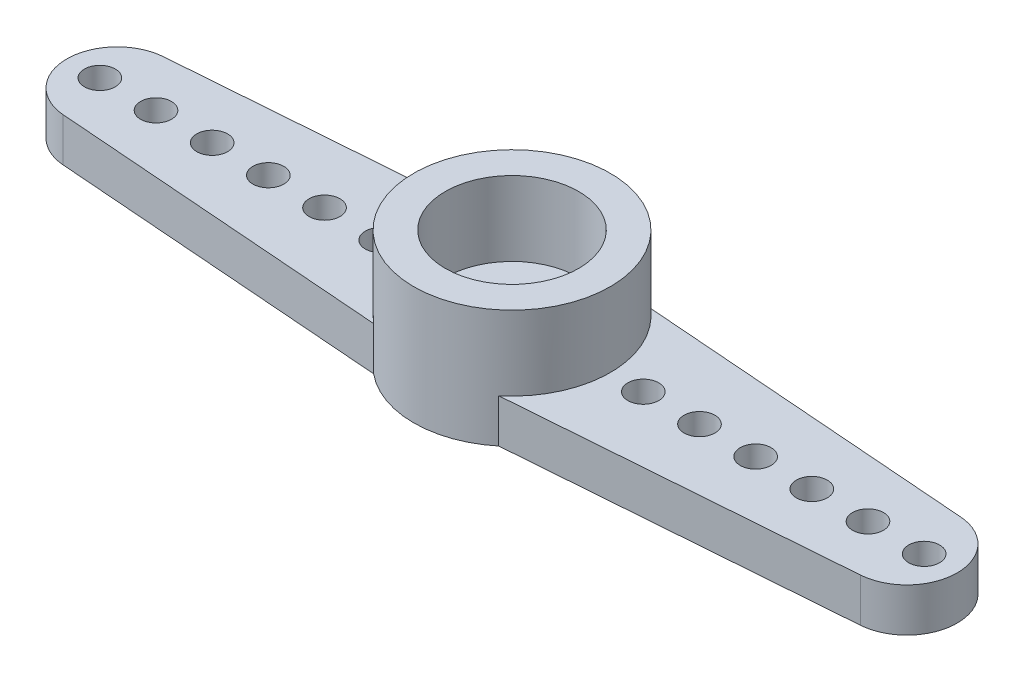
ISO-10303-21;
HEADER;
FILE_DESCRIPTION(('STEP AP214'),'2;1');
FILE_NAME('part.step','',(''),(''),'','','');
FILE_SCHEMA(('AUTOMOTIVE_DESIGN { 1 0 10303 214 1 1 1 1 }'));
ENDSEC;
DATA;
#1=APPLICATION_CONTEXT('core data for automotive mechanical design processes');
#2=APPLICATION_PROTOCOL_DEFINITION('international standard','automotive_design',2000,#1);
#3=PRODUCT_CONTEXT('',#1,'mechanical');
#4=PRODUCT('Part','Part','',(#3));
#5=PRODUCT_RELATED_PRODUCT_CATEGORY('part','',(#4));
#6=PRODUCT_DEFINITION_FORMATION('','',#4);
#7=PRODUCT_DEFINITION_CONTEXT('part definition',#1,'design');
#8=PRODUCT_DEFINITION('design','',#6,#7);
#9=PRODUCT_DEFINITION_SHAPE('','',#8);
#10=(LENGTH_UNIT() NAMED_UNIT(*) SI_UNIT(.MILLI.,.METRE.));
#11=(NAMED_UNIT(*) PLANE_ANGLE_UNIT() SI_UNIT($,.RADIAN.));
#12=(NAMED_UNIT(*) SI_UNIT($,.STERADIAN.) SOLID_ANGLE_UNIT());
#13=UNCERTAINTY_MEASURE_WITH_UNIT(LENGTH_MEASURE(1.E-05),#10,'distance_accuracy_value','');
#14=(GEOMETRIC_REPRESENTATION_CONTEXT(3) GLOBAL_UNCERTAINTY_ASSIGNED_CONTEXT((#13)) GLOBAL_UNIT_ASSIGNED_CONTEXT((#10,
#11,#12)) REPRESENTATION_CONTEXT('',''));
#15=CARTESIAN_POINT('',(0.,0.,0.));
#16=DIRECTION('',(0.,0.,1.));
#17=DIRECTION('',(1.,0.,0.));
#18=AXIS2_PLACEMENT_3D('',#15,#16,#17);
#19=CARTESIAN_POINT('',(14.1944880307206,1.705,-1.78667177447598));
#20=CARTESIAN_POINT('',(14.1944880307207,1.65333333333337,-1.78667177447597));
#21=CARTESIAN_POINT('',(14.1944880307206,1.60166666666662,-1.78667177447598));
#22=CARTESIAN_POINT('',(14.1944880307206,1.03333333333377,-1.78667177447598));
#23=CARTESIAN_POINT('',(14.1944880307211,0.516666666666661,-1.78667177447595));
#24=CARTESIAN_POINT('',(14.1944880307206,-0.0516666666666656,-1.78667177447599));
#25=CARTESIAN_POINT('',(14.1944880307206,-0.103333333333332,-1.78667177447598));
#26=CARTESIAN_POINT('',(14.1944880307206,-0.154999999999999,-1.78667177447598));
#27=CARTESIAN_POINT('',(17.2868347958286,1.705,-1.55066965502484));
#28=CARTESIAN_POINT('',(17.2868347958281,1.65333333333317,-1.55066965502464));
#29=CARTESIAN_POINT('',(17.2868347958288,1.60166666666689,-1.55066965502491));
#30=CARTESIAN_POINT('',(17.2868347958268,1.03333333333114,-1.55066965502417));
#31=CARTESIAN_POINT('',(17.2868347958268,0.516666666666661,-1.55066965502417));
#32=CARTESIAN_POINT('',(17.2868347958288,-0.0516666666666656,-1.55066965502491));
#33=CARTESIAN_POINT('',(17.2868347958286,-0.103333333333332,-1.55066965502484));
#34=CARTESIAN_POINT('',(17.2868347958286,-0.154999999999999,-1.55066965502484));
#35=CARTESIAN_POINT('',(17.2868347958286,1.705,1.55066965502484));
#36=CARTESIAN_POINT('',(17.2868347958281,1.65333333333319,1.55066965502454));
#37=CARTESIAN_POINT('',(17.2868347958288,1.60166666666686,1.55066965502494));
#38=CARTESIAN_POINT('',(17.2868347958268,1.03333333333142,1.55066965502383));
#39=CARTESIAN_POINT('',(17.2868347958268,0.516666666666661,1.55066965502383));
#40=CARTESIAN_POINT('',(17.2868347958288,-0.0516666666666656,1.55066965502494));
#41=CARTESIAN_POINT('',(17.2868347958286,-0.103333333333332,1.55066965502484));
#42=CARTESIAN_POINT('',(17.2868347958286,-0.154999999999999,1.55066965502484));
#43=CARTESIAN_POINT('',(14.1944880307206,1.705,1.78667177447598));
#44=CARTESIAN_POINT('',(14.1944880307207,1.6533333333334,1.78667177447597));
#45=CARTESIAN_POINT('',(14.1944880307206,1.60166666666658,1.78667177447598));
#46=CARTESIAN_POINT('',(14.1944880307206,1.03333333333416,1.78667177447598));
#47=CARTESIAN_POINT('',(14.1944880307211,0.516666666666661,1.78667177447595));
#48=CARTESIAN_POINT('',(14.1944880307206,-0.0516666666666656,1.78667177447599));
#49=CARTESIAN_POINT('',(14.1944880307206,-0.103333333333332,1.78667177447598));
#50=CARTESIAN_POINT('',(14.1944880307206,-0.154999999999999,1.78667177447598));
#51=(BOUNDED_SURFACE() B_SPLINE_SURFACE(3,3,((#19,#20,#21,#22,#23,#24,#25,#26),(#27,#28,#29,#30,
#31,#32,#33,#34),(#35,#36,#37,#38,#39,#40,#41,#42),(#43,#44,#45,#46,#47,#48,#49,#50)),
.UNSPECIFIED.,.F.,.F.,.F.) B_SPLINE_SURFACE_WITH_KNOTS((4,4),(4,2,2,4),(0.,1.),(-0.1,0.,1.,1.1),
.UNSPECIFIED.) GEOMETRIC_REPRESENTATION_ITEM() RATIONAL_B_SPLINE_SURFACE(((1.,1.,1.,1.,1.,1.,1.,
1.),(0.384064559610617,0.384064559610617,0.384064559610617,0.384064559610617,0.384064559610617,
0.384064559610617,0.384064559610617,0.384064559610617),(0.384064559610617,0.384064559610617,
0.384064559610617,0.384064559610617,0.384064559610617,0.384064559610617,0.384064559610617,
0.384064559610617),(1.,1.,1.,1.,1.,1.,1.,1.))) REPRESENTATION_ITEM('') SURFACE());
#52=CARTESIAN_POINT('',(14.1944880307206,-0.154999999999999,-1.78667177447598));
#53=CARTESIAN_POINT('',(14.1944880307206,-0.103333333333332,-1.78667177447598));
#54=CARTESIAN_POINT('',(14.1944880307206,-0.0516666666666656,-1.78667177447599));
#55=CARTESIAN_POINT('',(14.1944880307211,0.516666666666661,-1.78667177447595));
#56=CARTESIAN_POINT('',(14.1944880307206,1.03333333333377,-1.78667177447598));
#57=CARTESIAN_POINT('',(14.1944880307206,1.60166666666662,-1.78667177447598));
#58=CARTESIAN_POINT('',(14.1944880307207,1.65333333333337,-1.78667177447597));
#59=CARTESIAN_POINT('',(14.1944880307206,1.705,-1.78667177447598));
#60=(BOUNDED_CURVE() B_SPLINE_CURVE(3,(#52,#53,#54,#55,#56,#57,#58,#59),.UNSPECIFIED.,.F.,
.F.) B_SPLINE_CURVE_WITH_KNOTS((4,2,2,4),(-0.1,0.,1.,1.1),
.UNSPECIFIED.) CURVE() GEOMETRIC_REPRESENTATION_ITEM() RATIONAL_B_SPLINE_CURVE((1.,1.,1.,1.,1.,
1.,1.,1.)) REPRESENTATION_ITEM(''));
#61=CARTESIAN_POINT('',(14.1944880307206,1.55,-1.78667177447598));
#62=VERTEX_POINT('',#61);
#63=CARTESIAN_POINT('',(14.1944880307206,0.,-1.78667177447598));
#64=VERTEX_POINT('',#63);
#65=EDGE_CURVE('E274',#62,#64,#60,.F.);
#66=CARTESIAN_POINT('',(14.1944880307206,1.55,-1.78667177447598));
#67=CARTESIAN_POINT('',(17.2868347958286,1.55,-1.55066965502484));
#68=CARTESIAN_POINT('',(17.2868347958286,1.55,1.55066965502484));
#69=CARTESIAN_POINT('',(14.1944880307206,1.55,1.78667177447598));
#70=(BOUNDED_CURVE() B_SPLINE_CURVE(3,(#66,#67,#68,#69),.UNSPECIFIED.,.F.,
.F.) B_SPLINE_CURVE_WITH_KNOTS((4,4),(0.,1.),
.UNSPECIFIED.) CURVE() GEOMETRIC_REPRESENTATION_ITEM() RATIONAL_B_SPLINE_CURVE((1.,
0.384064559610617,0.384064559610617,1.)) REPRESENTATION_ITEM(''));
#71=CARTESIAN_POINT('',(14.1944880307206,1.55,1.78667177447598));
#72=VERTEX_POINT('',#71);
#73=EDGE_CURVE('E45',#72,#62,#70,.F.);
#74=CARTESIAN_POINT('',(14.1944880307206,1.705,1.78667177447598));
#75=CARTESIAN_POINT('',(14.1944880307207,1.6533333333334,1.78667177447597));
#76=CARTESIAN_POINT('',(14.1944880307206,1.60166666666658,1.78667177447598));
#77=CARTESIAN_POINT('',(14.1944880307206,1.03333333333416,1.78667177447598));
#78=CARTESIAN_POINT('',(14.1944880307211,0.516666666666661,1.78667177447595));
#79=CARTESIAN_POINT('',(14.1944880307206,-0.0516666666666656,1.78667177447599));
#80=CARTESIAN_POINT('',(14.1944880307206,-0.103333333333332,1.78667177447598));
#81=CARTESIAN_POINT('',(14.1944880307206,-0.154999999999999,1.78667177447598));
#82=(BOUNDED_CURVE() B_SPLINE_CURVE(3,(#74,#75,#76,#77,#78,#79,#80,#81),.UNSPECIFIED.,.F.,
.F.) B_SPLINE_CURVE_WITH_KNOTS((4,2,2,4),(-0.1,0.,1.,1.1),
.UNSPECIFIED.) CURVE() GEOMETRIC_REPRESENTATION_ITEM() RATIONAL_B_SPLINE_CURVE((1.,1.,1.,1.,1.,
1.,1.,1.)) REPRESENTATION_ITEM(''));
#83=CARTESIAN_POINT('',(14.1944880307206,0.,1.78667177447598));
#84=VERTEX_POINT('',#83);
#85=EDGE_CURVE('E107',#84,#72,#82,.F.);
#86=CARTESIAN_POINT('',(14.1944880307206,0.,1.78667177447598));
#87=CARTESIAN_POINT('',(17.2868347958286,0.,1.55066965502484));
#88=CARTESIAN_POINT('',(17.2868347958286,0.,-1.55066965502484));
#89=CARTESIAN_POINT('',(14.1944880307206,0.,-1.78667177447598));
#90=(BOUNDED_CURVE() B_SPLINE_CURVE(3,(#86,#87,#88,#89),.UNSPECIFIED.,.F.,
.F.) B_SPLINE_CURVE_WITH_KNOTS((4,4),(0.,1.),
.UNSPECIFIED.) CURVE() GEOMETRIC_REPRESENTATION_ITEM() RATIONAL_B_SPLINE_CURVE((1.,
0.384064559610617,0.384064559610617,1.)) REPRESENTATION_ITEM(''));
#91=EDGE_CURVE('E11',#64,#84,#90,.F.);
#92=ORIENTED_EDGE('',*,*,#65,.F.);
#93=ORIENTED_EDGE('',*,*,#73,.F.);
#94=ORIENTED_EDGE('',*,*,#85,.F.);
#95=ORIENTED_EDGE('',*,*,#91,.F.);
#96=EDGE_LOOP('',(#92,#93,#94,#95));
#97=FACE_BOUND('',#96,.T.);
#98=ADVANCED_FACE('F33',(#97),#51,.T.);
#99=CARTESIAN_POINT('',(-14.1944880307206,1.705,1.78667177447598));
#100=CARTESIAN_POINT('',(-14.1944880307206,1.6533333333334,1.78667177447598));
#101=CARTESIAN_POINT('',(-14.1944880307206,1.60166666666658,1.78667177447598));
#102=CARTESIAN_POINT('',(-14.1944880307206,1.03333333333416,1.78667177447598));
#103=CARTESIAN_POINT('',(-14.1944880307206,0.516666666666661,1.78667177447598));
#104=CARTESIAN_POINT('',(-14.1944880307206,-0.0516666666666656,1.78667177447598));
#105=CARTESIAN_POINT('',(-14.1944880307206,-0.103333333333332,1.78667177447598));
#106=CARTESIAN_POINT('',(-14.1944880307206,-0.154999999999999,1.78667177447598));
#107=CARTESIAN_POINT('',(-17.2868347958286,1.705,1.55066965502484));
#108=CARTESIAN_POINT('',(-17.2868347958286,1.65333333333319,1.55066965502484));
#109=CARTESIAN_POINT('',(-17.2868347958287,1.60166666666686,1.55066965502491));
#110=CARTESIAN_POINT('',(-17.2868347958277,1.03333333333142,1.55066965502417));
#111=CARTESIAN_POINT('',(-17.2868347958286,0.516666666666661,1.55066965502484));
#112=CARTESIAN_POINT('',(-17.2868347958286,-0.0516666666666656,1.55066965502484));
#113=CARTESIAN_POINT('',(-17.2868347958286,-0.103333333333332,1.55066965502484));
#114=CARTESIAN_POINT('',(-17.2868347958286,-0.154999999999999,1.55066965502484));
#115=CARTESIAN_POINT('',(-17.2868347958286,1.705,-1.55066965502484));
#116=CARTESIAN_POINT('',(-17.2868347958286,1.65333333333317,-1.55066965502484));
#117=CARTESIAN_POINT('',(-17.2868347958287,1.60166666666689,-1.55066965502494));
#118=CARTESIAN_POINT('',(-17.2868347958277,1.03333333333114,-1.55066965502389));
#119=CARTESIAN_POINT('',(-17.2868347958286,0.516666666666661,-1.55066965502484));
#120=CARTESIAN_POINT('',(-17.2868347958286,-0.0516666666666656,-1.55066965502484));
#121=CARTESIAN_POINT('',(-17.2868347958286,-0.103333333333332,-1.55066965502484));
#122=CARTESIAN_POINT('',(-17.2868347958286,-0.154999999999999,-1.55066965502484));
#123=CARTESIAN_POINT('',(-14.1944880307206,1.705,-1.78667177447598));
#124=CARTESIAN_POINT('',(-14.1944880307206,1.65333333333337,-1.78667177447598));
#125=CARTESIAN_POINT('',(-14.1944880307206,1.60166666666662,-1.78667177447598));
#126=CARTESIAN_POINT('',(-14.1944880307206,1.03333333333377,-1.78667177447598));
#127=CARTESIAN_POINT('',(-14.1944880307206,0.516666666666661,-1.78667177447598));
#128=CARTESIAN_POINT('',(-14.1944880307206,-0.0516666666666656,-1.78667177447598));
#129=CARTESIAN_POINT('',(-14.1944880307206,-0.103333333333332,-1.78667177447598));
#130=CARTESIAN_POINT('',(-14.1944880307206,-0.154999999999999,-1.78667177447598));
#131=(BOUNDED_SURFACE() B_SPLINE_SURFACE(3,3,((#99,#100,#101,#102,#103,#104,#105,#106),(#107,
#108,#109,#110,#111,#112,#113,#114),(#115,#116,#117,#118,#119,#120,#121,#122),(#123,#124,#125,
#126,#127,#128,#129,#130)),.UNSPECIFIED.,.F.,.F.,.F.) B_SPLINE_SURFACE_WITH_KNOTS((4,4),(4,2,2,
4),(0.,1.),(-0.1,0.,1.,1.1),
.UNSPECIFIED.) GEOMETRIC_REPRESENTATION_ITEM() RATIONAL_B_SPLINE_SURFACE(((1.,1.,1.,1.,1.,1.,1.,
1.),(0.384064559610617,0.384064559610617,0.384064559610616,0.384064559610616,0.384064559610616,
0.384064559610616,0.384064559610617,0.384064559610617),(0.384064559610617,0.384064559610617,
0.384064559610616,0.384064559610616,0.384064559610616,0.384064559610616,0.384064559610617,
0.384064559610617),(1.,1.,1.,1.,1.,1.,1.,1.))) REPRESENTATION_ITEM('') SURFACE());
#132=CARTESIAN_POINT('',(-14.1944880307206,1.705,-1.78667177447598));
#133=CARTESIAN_POINT('',(-14.1944880307206,1.65333333333337,-1.78667177447598));
#134=CARTESIAN_POINT('',(-14.1944880307206,1.60166666666662,-1.78667177447598));
#135=CARTESIAN_POINT('',(-14.1944880307206,1.03333333333377,-1.78667177447598));
#136=CARTESIAN_POINT('',(-14.1944880307206,0.516666666666661,-1.78667177447598));
#137=CARTESIAN_POINT('',(-14.1944880307206,-0.0516666666666656,-1.78667177447598));
#138=CARTESIAN_POINT('',(-14.1944880307206,-0.103333333333332,-1.78667177447598));
#139=CARTESIAN_POINT('',(-14.1944880307206,-0.154999999999999,-1.78667177447598));
#140=(BOUNDED_CURVE() B_SPLINE_CURVE(3,(#132,#133,#134,#135,#136,#137,#138,#139),.UNSPECIFIED.,
.F.,.F.) B_SPLINE_CURVE_WITH_KNOTS((4,2,2,4),(-0.1,0.,1.,1.1),
.UNSPECIFIED.) CURVE() GEOMETRIC_REPRESENTATION_ITEM() RATIONAL_B_SPLINE_CURVE((1.,1.,1.,1.,1.,
1.,1.,1.)) REPRESENTATION_ITEM(''));
#141=CARTESIAN_POINT('',(-14.1944880307206,0.,-1.78667177447598));
#142=VERTEX_POINT('',#141);
#143=CARTESIAN_POINT('',(-14.1944880307206,1.55,-1.78667177447598));
#144=VERTEX_POINT('',#143);
#145=EDGE_CURVE('E155',#142,#144,#140,.F.);
#146=CARTESIAN_POINT('',(-14.1944880307206,0.,-1.78667177447598));
#147=CARTESIAN_POINT('',(-17.2868347958286,0.,-1.55066965502484));
#148=CARTESIAN_POINT('',(-17.2868347958286,0.,1.55066965502484));
#149=CARTESIAN_POINT('',(-14.1944880307206,0.,1.78667177447598));
#150=(BOUNDED_CURVE() B_SPLINE_CURVE(3,(#146,#147,#148,#149),.UNSPECIFIED.,.F.,
.F.) B_SPLINE_CURVE_WITH_KNOTS((4,4),(0.,1.),
.UNSPECIFIED.) CURVE() GEOMETRIC_REPRESENTATION_ITEM() RATIONAL_B_SPLINE_CURVE((1.,
0.384064559610616,0.384064559610616,1.)) REPRESENTATION_ITEM(''));
#151=CARTESIAN_POINT('',(-14.1944880307206,0.,1.78667177447598));
#152=VERTEX_POINT('',#151);
#153=EDGE_CURVE('E424',#152,#142,#150,.F.);
#154=CARTESIAN_POINT('',(-14.1944880307206,-0.154999999999999,1.78667177447598));
#155=CARTESIAN_POINT('',(-14.1944880307206,-0.103333333333332,1.78667177447598));
#156=CARTESIAN_POINT('',(-14.1944880307206,-0.0516666666666656,1.78667177447598));
#157=CARTESIAN_POINT('',(-14.1944880307206,0.516666666666661,1.78667177447598));
#158=CARTESIAN_POINT('',(-14.1944880307206,1.03333333333416,1.78667177447598));
#159=CARTESIAN_POINT('',(-14.1944880307206,1.60166666666658,1.78667177447598));
#160=CARTESIAN_POINT('',(-14.1944880307206,1.6533333333334,1.78667177447598));
#161=CARTESIAN_POINT('',(-14.1944880307206,1.705,1.78667177447598));
#162=(BOUNDED_CURVE() B_SPLINE_CURVE(3,(#154,#155,#156,#157,#158,#159,#160,#161),.UNSPECIFIED.,
.F.,.F.) B_SPLINE_CURVE_WITH_KNOTS((4,2,2,4),(-0.1,0.,1.,1.1),
.UNSPECIFIED.) CURVE() GEOMETRIC_REPRESENTATION_ITEM() RATIONAL_B_SPLINE_CURVE((1.,1.,1.,1.,1.,
1.,1.,1.)) REPRESENTATION_ITEM(''));
#163=CARTESIAN_POINT('',(-14.1944880307206,1.55,1.78667177447598));
#164=VERTEX_POINT('',#163);
#165=EDGE_CURVE('E173',#164,#152,#162,.F.);
#166=CARTESIAN_POINT('',(-14.1944880307206,1.55,1.78667177447598));
#167=CARTESIAN_POINT('',(-17.2868347958286,1.55,1.55066965502484));
#168=CARTESIAN_POINT('',(-17.2868347958286,1.55,-1.55066965502484));
#169=CARTESIAN_POINT('',(-14.1944880307206,1.55,-1.78667177447598));
#170=(BOUNDED_CURVE() B_SPLINE_CURVE(3,(#166,#167,#168,#169),.UNSPECIFIED.,.F.,
.F.) B_SPLINE_CURVE_WITH_KNOTS((4,4),(0.,1.),
.UNSPECIFIED.) CURVE() GEOMETRIC_REPRESENTATION_ITEM() RATIONAL_B_SPLINE_CURVE((1.,
0.384064559610616,0.384064559610616,1.)) REPRESENTATION_ITEM(''));
#171=EDGE_CURVE('E299',#144,#164,#170,.F.);
#172=ORIENTED_EDGE('',*,*,#145,.F.);
#173=ORIENTED_EDGE('',*,*,#153,.F.);
#174=ORIENTED_EDGE('',*,*,#165,.F.);
#175=ORIENTED_EDGE('',*,*,#171,.F.);
#176=EDGE_LOOP('',(#172,#173,#174,#175));
#177=FACE_BOUND('',#176,.T.);
#178=ADVANCED_FACE('F196',(#177),#131,.T.);
#179=CARTESIAN_POINT('',(0.,1.55,0.));
#180=DIRECTION('',(0.,1.,0.));
#181=DIRECTION('',(0.,0.,1.));
#182=AXIS2_PLACEMENT_3D('',#179,#180,#181);
#183=PLANE('',#182);
#184=DIRECTION('',(0.997100431767486,0.,-0.0760968394159256));
#185=VECTOR('',#184,1.);
#186=CARTESIAN_POINT('',(2.22710574513201,1.55,2.7));
#187=LINE('',#186,#185);
#188=CARTESIAN_POINT('',(2.22710574513201,1.55,2.70000000000001));
#189=VERTEX_POINT('',#188);
#190=EDGE_CURVE('E102',#189,#72,#187,.T.);
#191=ORIENTED_EDGE('',*,*,#190,.T.);
#192=ORIENTED_EDGE('',*,*,#73,.T.);
#193=DIRECTION('',(-0.997100431767486,0.,-0.0760968394159256));
#194=VECTOR('',#193,1.);
#195=CARTESIAN_POINT('',(2.22710574513201,1.55,-2.7));
#196=LINE('',#195,#194);
#197=CARTESIAN_POINT('',(2.22710574513201,1.55,-2.7));
#198=VERTEX_POINT('',#197);
#199=EDGE_CURVE('E111',#62,#198,#196,.T.);
#200=ORIENTED_EDGE('',*,*,#199,.T.);
#201=CARTESIAN_POINT('',(0.,1.55,0.));
#202=DIRECTION('',(0.,1.,0.));
#203=DIRECTION('',(0.,0.,1.));
#204=AXIS2_PLACEMENT_3D('',#201,#202,#203);
#205=CIRCLE('',#204,3.50000000000001);
#206=EDGE_CURVE('E119',#189,#198,#205,.T.);
#207=ORIENTED_EDGE('',*,*,#206,.F.);
#208=EDGE_LOOP('',(#191,#192,#200,#207));
#209=FACE_BOUND('',#208,.T.);
#210=CARTESIAN_POINT('',(12.675,1.55,0.));
#211=DIRECTION('',(0.,1.,0.));
#212=DIRECTION('',(0.,0.,1.));
#213=AXIS2_PLACEMENT_3D('',#210,#211,#212);
#214=CIRCLE('',#213,0.55);
#215=CARTESIAN_POINT('',(12.675,1.55,0.55));
#216=VERTEX_POINT('',#215);
#217=EDGE_CURVE('E341',#216,#216,#214,.T.);
#218=ORIENTED_EDGE('',*,*,#217,.F.);
#219=EDGE_LOOP('',(#218));
#220=FACE_BOUND('',#219,.T.);
#221=CARTESIAN_POINT('',(8.67499999999998,1.55,0.));
#222=DIRECTION('',(0.,1.,0.));
#223=DIRECTION('',(0.,0.,1.));
#224=AXIS2_PLACEMENT_3D('',#221,#222,#223);
#225=CIRCLE('',#224,0.55);
#226=CARTESIAN_POINT('',(8.67499999999998,1.55,0.55));
#227=VERTEX_POINT('',#226);
#228=EDGE_CURVE('E329',#227,#227,#225,.T.);
#229=ORIENTED_EDGE('',*,*,#228,.F.);
#230=EDGE_LOOP('',(#229));
#231=FACE_BOUND('',#230,.T.);
#232=CARTESIAN_POINT('',(4.67499999999998,1.55,0.));
#233=DIRECTION('',(0.,1.,0.));
#234=DIRECTION('',(0.,0.,1.));
#235=AXIS2_PLACEMENT_3D('',#232,#233,#234);
#236=CIRCLE('',#235,0.55);
#237=CARTESIAN_POINT('',(4.67499999999998,1.55,0.55));
#238=VERTEX_POINT('',#237);
#239=EDGE_CURVE('E317',#238,#238,#236,.T.);
#240=ORIENTED_EDGE('',*,*,#239,.F.);
#241=EDGE_LOOP('',(#240));
#242=FACE_BOUND('',#241,.T.);
#243=CARTESIAN_POINT('',(6.67499999999998,1.55,0.));
#244=DIRECTION('',(0.,1.,0.));
#245=DIRECTION('',(0.,0.,1.));
#246=AXIS2_PLACEMENT_3D('',#243,#244,#245);
#247=CIRCLE('',#246,0.55);
#248=CARTESIAN_POINT('',(6.67499999999998,1.55,0.55));
#249=VERTEX_POINT('',#248);
#250=EDGE_CURVE('E324',#249,#249,#247,.T.);
#251=ORIENTED_EDGE('',*,*,#250,.F.);
#252=EDGE_LOOP('',(#251));
#253=FACE_BOUND('',#252,.T.);
#254=CARTESIAN_POINT('',(10.675,1.55,0.));
#255=DIRECTION('',(0.,1.,0.));
#256=DIRECTION('',(0.,0.,1.));
#257=AXIS2_PLACEMENT_3D('',#254,#255,#256);
#258=CIRCLE('',#257,0.550000000000001);
#259=CARTESIAN_POINT('',(10.675,1.55,0.550000000000001));
#260=VERTEX_POINT('',#259);
#261=EDGE_CURVE('E335',#260,#260,#258,.T.);
#262=ORIENTED_EDGE('',*,*,#261,.F.);
#263=EDGE_LOOP('',(#262));
#264=FACE_BOUND('',#263,.T.);
#265=CARTESIAN_POINT('',(14.675,1.55,0.));
#266=DIRECTION('',(0.,1.,0.));
#267=DIRECTION('',(0.,0.,1.));
#268=AXIS2_PLACEMENT_3D('',#265,#266,#267);
#269=CIRCLE('',#268,0.550000000000001);
#270=CARTESIAN_POINT('',(14.675,1.55,0.550000000000001));
#271=VERTEX_POINT('',#270);
#272=EDGE_CURVE('E347',#271,#271,#269,.T.);
#273=ORIENTED_EDGE('',*,*,#272,.F.);
#274=EDGE_LOOP('',(#273));
#275=FACE_BOUND('',#274,.T.);
#276=ADVANCED_FACE('F126',(#209,#220,#231,#242,#253,#264,#275),#183,.T.);
#277=CARTESIAN_POINT('',(0.,1.55,0.));
#278=DIRECTION('',(0.,1.,0.));
#279=DIRECTION('',(0.,0.,1.));
#280=AXIS2_PLACEMENT_3D('',#277,#278,#279);
#281=CIRCLE('',#280,1.225);
#282=CARTESIAN_POINT('',(0.,1.55,-1.225));
#283=VERTEX_POINT('',#282);
#284=EDGE_CURVE('E142',#283,#283,#281,.T.);
#285=ORIENTED_EDGE('',*,*,#284,.F.);
#286=EDGE_LOOP('',(#285));
#287=FACE_BOUND('',#286,.T.);
#288=CARTESIAN_POINT('',(0.,1.55,0.));
#289=DIRECTION('',(0.,1.,0.));
#290=DIRECTION('',(0.,0.,1.));
#291=AXIS2_PLACEMENT_3D('',#288,#289,#290);
#292=CIRCLE('',#291,2.375);
#293=CARTESIAN_POINT('',(0.,1.55,2.375));
#294=VERTEX_POINT('',#293);
#295=EDGE_CURVE('E137',#294,#294,#292,.T.);
#296=ORIENTED_EDGE('',*,*,#295,.T.);
#297=EDGE_LOOP('',(#296));
#298=FACE_BOUND('',#297,.T.);
#299=ADVANCED_FACE('F399',(#287,#298),#183,.T.);
#300=DIRECTION('',(-0.997100431767486,0.,0.0760968394159257));
#301=VECTOR('',#300,1.);
#302=CARTESIAN_POINT('',(-2.22710574513203,1.55,-2.7));
#303=LINE('',#302,#301);
#304=CARTESIAN_POINT('',(-2.22710574513203,1.55,-2.7));
#305=VERTEX_POINT('',#304);
#306=EDGE_CURVE('E164',#305,#144,#303,.T.);
#307=ORIENTED_EDGE('',*,*,#306,.T.);
#308=ORIENTED_EDGE('',*,*,#171,.T.);
#309=DIRECTION('',(0.997100431767486,0.,0.0760968394159256));
#310=VECTOR('',#309,1.);
#311=CARTESIAN_POINT('',(-2.22710574513199,1.55,2.7));
#312=LINE('',#311,#310);
#313=CARTESIAN_POINT('',(-2.22710574513199,1.55,2.7));
#314=VERTEX_POINT('',#313);
#315=EDGE_CURVE('E112',#164,#314,#312,.T.);
#316=ORIENTED_EDGE('',*,*,#315,.T.);
#317=EDGE_CURVE('E151',#305,#314,#205,.T.);
#318=ORIENTED_EDGE('',*,*,#317,.F.);
#319=EDGE_LOOP('',(#307,#308,#316,#318));
#320=FACE_BOUND('',#319,.T.);
#321=CARTESIAN_POINT('',(-4.67499999999998,1.55,0.));
#322=DIRECTION('',(0.,1.,0.));
#323=DIRECTION('',(0.,0.,-1.));
#324=AXIS2_PLACEMENT_3D('',#321,#322,#323);
#325=CIRCLE('',#324,0.550000000000002);
#326=CARTESIAN_POINT('',(-4.67499999999998,1.55,-0.550000000000002));
#327=VERTEX_POINT('',#326);
#328=EDGE_CURVE('E383',#327,#327,#325,.T.);
#329=ORIENTED_EDGE('',*,*,#328,.F.);
#330=EDGE_LOOP('',(#329));
#331=FACE_BOUND('',#330,.T.);
#332=CARTESIAN_POINT('',(-8.67499999999998,1.55,0.));
#333=DIRECTION('',(0.,1.,0.));
#334=DIRECTION('',(0.,0.,-1.));
#335=AXIS2_PLACEMENT_3D('',#332,#333,#334);
#336=CIRCLE('',#335,0.55);
#337=CARTESIAN_POINT('',(-8.67499999999998,1.55,-0.55));
#338=VERTEX_POINT('',#337);
#339=EDGE_CURVE('E371',#338,#338,#336,.T.);
#340=ORIENTED_EDGE('',*,*,#339,.F.);
#341=EDGE_LOOP('',(#340));
#342=FACE_BOUND('',#341,.T.);
#343=CARTESIAN_POINT('',(-12.675,1.55,0.));
#344=DIRECTION('',(0.,1.,0.));
#345=DIRECTION('',(0.,0.,-1.));
#346=AXIS2_PLACEMENT_3D('',#343,#344,#345);
#347=CIRCLE('',#346,0.55);
#348=CARTESIAN_POINT('',(-12.675,1.55,-0.55));
#349=VERTEX_POINT('',#348);
#350=EDGE_CURVE('E359',#349,#349,#347,.T.);
#351=ORIENTED_EDGE('',*,*,#350,.F.);
#352=EDGE_LOOP('',(#351));
#353=FACE_BOUND('',#352,.T.);
#354=CARTESIAN_POINT('',(-14.675,1.55,0.));
#355=DIRECTION('',(0.,1.,0.));
#356=DIRECTION('',(0.,0.,-1.));
#357=AXIS2_PLACEMENT_3D('',#354,#355,#356);
#358=CIRCLE('',#357,0.550000000000001);
#359=CARTESIAN_POINT('',(-14.675,1.55,-0.550000000000001));
#360=VERTEX_POINT('',#359);
#361=EDGE_CURVE('E353',#360,#360,#358,.T.);
#362=ORIENTED_EDGE('',*,*,#361,.F.);
#363=EDGE_LOOP('',(#362));
#364=FACE_BOUND('',#363,.T.);
#365=CARTESIAN_POINT('',(-10.675,1.55,0.));
#366=DIRECTION('',(0.,1.,0.));
#367=DIRECTION('',(0.,0.,-1.));
#368=AXIS2_PLACEMENT_3D('',#365,#366,#367);
#369=CIRCLE('',#368,0.550000000000001);
#370=CARTESIAN_POINT('',(-10.675,1.55,-0.550000000000001));
#371=VERTEX_POINT('',#370);
#372=EDGE_CURVE('E365',#371,#371,#369,.T.);
#373=ORIENTED_EDGE('',*,*,#372,.F.);
#374=EDGE_LOOP('',(#373));
#375=FACE_BOUND('',#374,.T.);
#376=CARTESIAN_POINT('',(-6.67499999999998,1.55,0.));
#377=DIRECTION('',(0.,1.,0.));
#378=DIRECTION('',(0.,0.,-1.));
#379=AXIS2_PLACEMENT_3D('',#376,#377,#378);
#380=CIRCLE('',#379,0.550000000000002);
#381=CARTESIAN_POINT('',(-6.67499999999998,1.55,-0.550000000000002));
#382=VERTEX_POINT('',#381);
#383=EDGE_CURVE('E377',#382,#382,#380,.T.);
#384=ORIENTED_EDGE('',*,*,#383,.F.);
#385=EDGE_LOOP('',(#384));
#386=FACE_BOUND('',#385,.T.);
#387=ADVANCED_FACE('F255',(#320,#331,#342,#353,#364,#375,#386),#183,.T.);
#388=CARTESIAN_POINT('',(0.,0.,0.));
#389=DIRECTION('',(0.,1.,0.));
#390=DIRECTION('',(0.,0.,1.));
#391=AXIS2_PLACEMENT_3D('',#388,#389,#390);
#392=PLANE('',#391);
#393=CARTESIAN_POINT('',(-4.67499999999998,0.,0.));
#394=DIRECTION('',(0.,1.,0.));
#395=DIRECTION('',(0.,0.,-1.));
#396=AXIS2_PLACEMENT_3D('',#393,#394,#395);
#397=CIRCLE('',#396,0.550000000000002);
#398=CARTESIAN_POINT('',(-4.67499999999998,0.,-0.550000000000002));
#399=VERTEX_POINT('',#398);
#400=EDGE_CURVE('E386',#399,#399,#397,.T.);
#401=ORIENTED_EDGE('',*,*,#400,.T.);
#402=EDGE_LOOP('',(#401));
#403=FACE_BOUND('',#402,.T.);
#404=CARTESIAN_POINT('',(-8.67499999999998,0.,0.));
#405=DIRECTION('',(0.,1.,0.));
#406=DIRECTION('',(0.,0.,-1.));
#407=AXIS2_PLACEMENT_3D('',#404,#405,#406);
#408=CIRCLE('',#407,0.55);
#409=CARTESIAN_POINT('',(-8.67499999999998,0.,-0.55));
#410=VERTEX_POINT('',#409);
#411=EDGE_CURVE('E374',#410,#410,#408,.T.);
#412=ORIENTED_EDGE('',*,*,#411,.T.);
#413=EDGE_LOOP('',(#412));
#414=FACE_BOUND('',#413,.T.);
#415=CARTESIAN_POINT('',(-12.675,0.,0.));
#416=DIRECTION('',(0.,1.,0.));
#417=DIRECTION('',(0.,0.,-1.));
#418=AXIS2_PLACEMENT_3D('',#415,#416,#417);
#419=CIRCLE('',#418,0.55);
#420=CARTESIAN_POINT('',(-12.675,0.,-0.55));
#421=VERTEX_POINT('',#420);
#422=EDGE_CURVE('E362',#421,#421,#419,.T.);
#423=ORIENTED_EDGE('',*,*,#422,.T.);
#424=EDGE_LOOP('',(#423));
#425=FACE_BOUND('',#424,.T.);
#426=CARTESIAN_POINT('',(14.675,0.,0.));
#427=DIRECTION('',(0.,1.,0.));
#428=DIRECTION('',(0.,0.,1.));
#429=AXIS2_PLACEMENT_3D('',#426,#427,#428);
#430=CIRCLE('',#429,0.550000000000001);
#431=CARTESIAN_POINT('',(14.675,0.,0.550000000000001));
#432=VERTEX_POINT('',#431);
#433=EDGE_CURVE('E350',#432,#432,#430,.T.);
#434=ORIENTED_EDGE('',*,*,#433,.T.);
#435=EDGE_LOOP('',(#434));
#436=FACE_BOUND('',#435,.T.);
#437=CARTESIAN_POINT('',(10.675,0.,0.));
#438=DIRECTION('',(0.,1.,0.));
#439=DIRECTION('',(0.,0.,1.));
#440=AXIS2_PLACEMENT_3D('',#437,#438,#439);
#441=CIRCLE('',#440,0.550000000000001);
#442=CARTESIAN_POINT('',(10.675,0.,0.550000000000001));
#443=VERTEX_POINT('',#442);
#444=EDGE_CURVE('E338',#443,#443,#441,.T.);
#445=ORIENTED_EDGE('',*,*,#444,.T.);
#446=EDGE_LOOP('',(#445));
#447=FACE_BOUND('',#446,.T.);
#448=CARTESIAN_POINT('',(6.67499999999998,0.,0.));
#449=DIRECTION('',(0.,1.,0.));
#450=DIRECTION('',(0.,0.,1.));
#451=AXIS2_PLACEMENT_3D('',#448,#449,#450);
#452=CIRCLE('',#451,0.55);
#453=CARTESIAN_POINT('',(6.67499999999998,0.,0.55));
#454=VERTEX_POINT('',#453);
#455=EDGE_CURVE('E326',#454,#454,#452,.T.);
#456=ORIENTED_EDGE('',*,*,#455,.T.);
#457=EDGE_LOOP('',(#456));
#458=FACE_BOUND('',#457,.T.);
#459=DIRECTION('',(-0.997100431767486,0.,-0.0760968394159256));
#460=VECTOR('',#459,1.);
#461=CARTESIAN_POINT('',(2.22710574513201,0.,-2.7));
#462=LINE('',#461,#460);
#463=CARTESIAN_POINT('',(2.22710574513201,0.,-2.7));
#464=VERTEX_POINT('',#463);
#465=EDGE_CURVE('E229',#64,#464,#462,.T.);
#466=ORIENTED_EDGE('',*,*,#465,.F.);
#467=ORIENTED_EDGE('',*,*,#91,.T.);
#468=DIRECTION('',(0.997100431767486,0.,-0.0760968394159256));
#469=VECTOR('',#468,1.);
#470=CARTESIAN_POINT('',(2.22710574513201,0.,2.7));
#471=LINE('',#470,#469);
#472=CARTESIAN_POINT('',(2.22710574513201,0.,2.7));
#473=VERTEX_POINT('',#472);
#474=EDGE_CURVE('E225',#473,#84,#471,.T.);
#475=ORIENTED_EDGE('',*,*,#474,.F.);
#476=CARTESIAN_POINT('',(0.,0.,0.));
#477=DIRECTION('',(0.,1.,0.));
#478=DIRECTION('',(0.,0.,1.));
#479=AXIS2_PLACEMENT_3D('',#476,#477,#478);
#480=CIRCLE('',#479,3.49999999999999);
#481=CARTESIAN_POINT('',(-2.22710574513199,0.,2.7));
#482=VERTEX_POINT('',#481);
#483=EDGE_CURVE('E122',#482,#473,#480,.T.);
#484=ORIENTED_EDGE('',*,*,#483,.F.);
#485=DIRECTION('',(0.997100431767486,0.,0.0760968394159256));
#486=VECTOR('',#485,1.);
#487=CARTESIAN_POINT('',(-2.22710574513199,0.,2.7));
#488=LINE('',#487,#486);
#489=EDGE_CURVE('E165',#152,#482,#488,.T.);
#490=ORIENTED_EDGE('',*,*,#489,.F.);
#491=ORIENTED_EDGE('',*,*,#153,.T.);
#492=DIRECTION('',(-0.997100431767486,0.,0.0760968394159257));
#493=VECTOR('',#492,1.);
#494=CARTESIAN_POINT('',(-2.22710574513203,0.,-2.7));
#495=LINE('',#494,#493);
#496=CARTESIAN_POINT('',(-2.22710574513203,0.,-2.7));
#497=VERTEX_POINT('',#496);
#498=EDGE_CURVE('E214',#497,#142,#495,.T.);
#499=ORIENTED_EDGE('',*,*,#498,.F.);
#500=CARTESIAN_POINT('',(0.,0.,0.));
#501=DIRECTION('',(0.,1.,0.));
#502=DIRECTION('',(0.,0.,1.));
#503=AXIS2_PLACEMENT_3D('',#500,#501,#502);
#504=CIRCLE('',#503,3.50000000000001);
#505=EDGE_CURVE('E217',#464,#497,#504,.T.);
#506=ORIENTED_EDGE('',*,*,#505,.F.);
#507=EDGE_LOOP('',(#466,#467,#475,#484,#490,#491,#499,#506));
#508=FACE_BOUND('',#507,.T.);
#509=CARTESIAN_POINT('',(4.67499999999998,0.,0.));
#510=DIRECTION('',(0.,1.,0.));
#511=DIRECTION('',(0.,0.,1.));
#512=AXIS2_PLACEMENT_3D('',#509,#510,#511);
#513=CIRCLE('',#512,0.55);
#514=CARTESIAN_POINT('',(4.67499999999998,0.,0.55));
#515=VERTEX_POINT('',#514);
#516=EDGE_CURVE('E319',#515,#515,#513,.T.);
#517=ORIENTED_EDGE('',*,*,#516,.T.);
#518=EDGE_LOOP('',(#517));
#519=FACE_BOUND('',#518,.T.);
#520=CARTESIAN_POINT('',(8.67499999999998,0.,0.));
#521=DIRECTION('',(0.,1.,0.));
#522=DIRECTION('',(0.,0.,1.));
#523=AXIS2_PLACEMENT_3D('',#520,#521,#522);
#524=CIRCLE('',#523,0.55);
#525=CARTESIAN_POINT('',(8.67499999999998,0.,0.55));
#526=VERTEX_POINT('',#525);
#527=EDGE_CURVE('E332',#526,#526,#524,.T.);
#528=ORIENTED_EDGE('',*,*,#527,.T.);
#529=EDGE_LOOP('',(#528));
#530=FACE_BOUND('',#529,.T.);
#531=CARTESIAN_POINT('',(12.675,0.,0.));
#532=DIRECTION('',(0.,1.,0.));
#533=DIRECTION('',(0.,0.,1.));
#534=AXIS2_PLACEMENT_3D('',#531,#532,#533);
#535=CIRCLE('',#534,0.55);
#536=CARTESIAN_POINT('',(12.675,0.,0.55));
#537=VERTEX_POINT('',#536);
#538=EDGE_CURVE('E344',#537,#537,#535,.T.);
#539=ORIENTED_EDGE('',*,*,#538,.T.);
#540=EDGE_LOOP('',(#539));
#541=FACE_BOUND('',#540,.T.);
#542=CARTESIAN_POINT('',(-14.675,0.,0.));
#543=DIRECTION('',(0.,1.,0.));
#544=DIRECTION('',(0.,0.,-1.));
#545=AXIS2_PLACEMENT_3D('',#542,#543,#544);
#546=CIRCLE('',#545,0.550000000000001);
#547=CARTESIAN_POINT('',(-14.675,0.,-0.550000000000001));
#548=VERTEX_POINT('',#547);
#549=EDGE_CURVE('E356',#548,#548,#546,.T.);
#550=ORIENTED_EDGE('',*,*,#549,.T.);
#551=EDGE_LOOP('',(#550));
#552=FACE_BOUND('',#551,.T.);
#553=CARTESIAN_POINT('',(-10.675,0.,0.));
#554=DIRECTION('',(0.,1.,0.));
#555=DIRECTION('',(0.,0.,-1.));
#556=AXIS2_PLACEMENT_3D('',#553,#554,#555);
#557=CIRCLE('',#556,0.550000000000001);
#558=CARTESIAN_POINT('',(-10.675,0.,-0.550000000000001));
#559=VERTEX_POINT('',#558);
#560=EDGE_CURVE('E368',#559,#559,#557,.T.);
#561=ORIENTED_EDGE('',*,*,#560,.T.);
#562=EDGE_LOOP('',(#561));
#563=FACE_BOUND('',#562,.T.);
#564=CARTESIAN_POINT('',(-6.67499999999998,0.,0.));
#565=DIRECTION('',(0.,1.,0.));
#566=DIRECTION('',(0.,0.,-1.));
#567=AXIS2_PLACEMENT_3D('',#564,#565,#566);
#568=CIRCLE('',#567,0.550000000000002);
#569=CARTESIAN_POINT('',(-6.67499999999998,0.,-0.550000000000002));
#570=VERTEX_POINT('',#569);
#571=EDGE_CURVE('E380',#570,#570,#568,.T.);
#572=ORIENTED_EDGE('',*,*,#571,.T.);
#573=EDGE_LOOP('',(#572));
#574=FACE_BOUND('',#573,.T.);
#575=CARTESIAN_POINT('',(0.,0.,0.));
#576=DIRECTION('',(0.,1.,0.));
#577=DIRECTION('',(0.,0.,1.));
#578=AXIS2_PLACEMENT_3D('',#575,#576,#577);
#579=CIRCLE('',#578,1.225);
#580=CARTESIAN_POINT('',(0.,0.,-1.225));
#581=VERTEX_POINT('',#580);
#582=EDGE_CURVE('E134',#581,#581,#579,.T.);
#583=ORIENTED_EDGE('',*,*,#582,.T.);
#584=EDGE_LOOP('',(#583));
#585=FACE_BOUND('',#584,.T.);
#586=ADVANCED_FACE('F194',(#403,#414,#425,#436,#447,#458,#508,#519,#530,#541,#552,#563,#574,
#585),#392,.F.);
#587=CARTESIAN_POINT('',(-2.22710574513203,1.55,-2.7));
#588=DIRECTION('',(0.0760968394159257,0.,0.997100431767486));
#589=DIRECTION('',(0.997100431767486,0.,-0.0760968394159257));
#590=AXIS2_PLACEMENT_3D('',#587,#588,#589);
#591=PLANE('',#590);
#592=ORIENTED_EDGE('',*,*,#498,.T.);
#593=ORIENTED_EDGE('',*,*,#145,.T.);
#594=ORIENTED_EDGE('',*,*,#306,.F.);
#595=DIRECTION('',(0.,-1.,0.));
#596=VECTOR('',#595,1.);
#597=CARTESIAN_POINT('',(-2.22710574513203,1.55,-2.7));
#598=LINE('',#597,#596);
#599=EDGE_CURVE('E156',#305,#497,#598,.T.);
#600=ORIENTED_EDGE('',*,*,#599,.T.);
#601=EDGE_LOOP('',(#592,#593,#594,#600));
#602=FACE_BOUND('',#601,.T.);
#603=ADVANCED_FACE('F190',(#602),#591,.F.);
#604=CARTESIAN_POINT('',(-2.22710574513199,1.55,2.7));
#605=DIRECTION('',(0.0760968394159256,0.,-0.997100431767486));
#606=DIRECTION('',(-0.997100431767486,0.,-0.0760968394159256));
#607=AXIS2_PLACEMENT_3D('',#604,#605,#606);
#608=PLANE('',#607);
#609=ORIENTED_EDGE('',*,*,#315,.F.);
#610=ORIENTED_EDGE('',*,*,#165,.T.);
#611=ORIENTED_EDGE('',*,*,#489,.T.);
#612=DIRECTION('',(0.,-1.,0.));
#613=VECTOR('',#612,1.);
#614=CARTESIAN_POINT('',(-2.22710574513199,1.55,2.7));
#615=LINE('',#614,#613);
#616=EDGE_CURVE('E123',#314,#482,#615,.T.);
#617=ORIENTED_EDGE('',*,*,#616,.F.);
#618=EDGE_LOOP('',(#609,#610,#611,#617));
#619=FACE_BOUND('',#618,.T.);
#620=ADVANCED_FACE('F180',(#619),#608,.F.);
#621=CARTESIAN_POINT('',(0.,1.55,0.));
#622=DIRECTION('',(0.,-1.,0.));
#623=DIRECTION('',(0.,0.,-1.));
#624=AXIS2_PLACEMENT_3D('',#621,#622,#623);
#625=CYLINDRICAL_SURFACE('',#624,3.49999999999999);
#626=ORIENTED_EDGE('',*,*,#483,.T.);
#627=DIRECTION('',(0.,-1.,0.));
#628=VECTOR('',#627,1.);
#629=CARTESIAN_POINT('',(2.22710574513201,1.55,2.7));
#630=LINE('',#629,#628);
#631=EDGE_CURVE('E106',#189,#473,#630,.T.);
#632=ORIENTED_EDGE('',*,*,#631,.F.);
#633=ORIENTED_EDGE('',*,*,#206,.T.);
#634=DIRECTION('',(0.,-1.,0.));
#635=VECTOR('',#634,1.);
#636=CARTESIAN_POINT('',(2.22710574513201,1.55,-2.7));
#637=LINE('',#636,#635);
#638=EDGE_CURVE('E124',#198,#464,#637,.T.);
#639=ORIENTED_EDGE('',*,*,#638,.T.);
#640=ORIENTED_EDGE('',*,*,#505,.T.);
#641=ORIENTED_EDGE('',*,*,#599,.F.);
#642=ORIENTED_EDGE('',*,*,#317,.T.);
#643=ORIENTED_EDGE('',*,*,#616,.T.);
#644=EDGE_LOOP('',(#626,#632,#633,#639,#640,#641,#642,#643));
#645=FACE_BOUND('',#644,.T.);
#646=CARTESIAN_POINT('',(0.,4.2,0.));
#647=DIRECTION('',(0.,1.,0.));
#648=DIRECTION('',(0.,0.,1.));
#649=AXIS2_PLACEMENT_3D('',#646,#647,#648);
#650=CIRCLE('',#649,3.50000000000001);
#651=CARTESIAN_POINT('',(0.,4.2,3.50000000000001));
#652=VERTEX_POINT('',#651);
#653=EDGE_CURVE('E130',#652,#652,#650,.T.);
#654=ORIENTED_EDGE('',*,*,#653,.F.);
#655=EDGE_LOOP('',(#654));
#656=FACE_BOUND('',#655,.T.);
#657=ADVANCED_FACE('F116',(#645,#656),#625,.T.);
#658=CARTESIAN_POINT('',(2.22710574513201,1.55,2.7));
#659=DIRECTION('',(-0.0760968394159256,0.,-0.997100431767486));
#660=DIRECTION('',(-0.997100431767486,0.,0.0760968394159256));
#661=AXIS2_PLACEMENT_3D('',#658,#659,#660);
#662=PLANE('',#661);
#663=ORIENTED_EDGE('',*,*,#474,.T.);
#664=ORIENTED_EDGE('',*,*,#85,.T.);
#665=ORIENTED_EDGE('',*,*,#190,.F.);
#666=ORIENTED_EDGE('',*,*,#631,.T.);
#667=EDGE_LOOP('',(#663,#664,#665,#666));
#668=FACE_BOUND('',#667,.T.);
#669=ADVANCED_FACE('F105',(#668),#662,.F.);
#670=CARTESIAN_POINT('',(2.22710574513201,1.55,-2.7));
#671=DIRECTION('',(-0.0760968394159256,0.,0.997100431767486));
#672=DIRECTION('',(0.997100431767486,0.,0.0760968394159256));
#673=AXIS2_PLACEMENT_3D('',#670,#671,#672);
#674=PLANE('',#673);
#675=ORIENTED_EDGE('',*,*,#199,.F.);
#676=ORIENTED_EDGE('',*,*,#65,.T.);
#677=ORIENTED_EDGE('',*,*,#465,.T.);
#678=ORIENTED_EDGE('',*,*,#638,.F.);
#679=EDGE_LOOP('',(#675,#676,#677,#678));
#680=FACE_BOUND('',#679,.T.);
#681=ADVANCED_FACE('F246',(#680),#674,.F.);
#682=CARTESIAN_POINT('',(4.67499999999998,1.55,0.));
#683=DIRECTION('',(0.,-1.,0.));
#684=DIRECTION('',(0.,0.,-1.));
#685=AXIS2_PLACEMENT_3D('',#682,#683,#684);
#686=CYLINDRICAL_SURFACE('',#685,0.55);
#687=ORIENTED_EDGE('',*,*,#239,.T.);
#688=EDGE_LOOP('',(#687));
#689=FACE_BOUND('',#688,.T.);
#690=ORIENTED_EDGE('',*,*,#516,.F.);
#691=EDGE_LOOP('',(#690));
#692=FACE_BOUND('',#691,.T.);
#693=ADVANCED_FACE('F250',(#689,#692),#686,.F.);
#694=CARTESIAN_POINT('',(6.67499999999998,1.55,0.));
#695=DIRECTION('',(0.,-1.,0.));
#696=DIRECTION('',(0.,0.,-1.));
#697=AXIS2_PLACEMENT_3D('',#694,#695,#696);
#698=CYLINDRICAL_SURFACE('',#697,0.55);
#699=ORIENTED_EDGE('',*,*,#250,.T.);
#700=EDGE_LOOP('',(#699));
#701=FACE_BOUND('',#700,.T.);
#702=ORIENTED_EDGE('',*,*,#455,.F.);
#703=EDGE_LOOP('',(#702));
#704=FACE_BOUND('',#703,.T.);
#705=ADVANCED_FACE('F523',(#701,#704),#698,.F.);
#706=CARTESIAN_POINT('',(8.67499999999998,1.55,0.));
#707=DIRECTION('',(0.,-1.,0.));
#708=DIRECTION('',(0.,0.,-1.));
#709=AXIS2_PLACEMENT_3D('',#706,#707,#708);
#710=CYLINDRICAL_SURFACE('',#709,0.55);
#711=ORIENTED_EDGE('',*,*,#228,.T.);
#712=EDGE_LOOP('',(#711));
#713=FACE_BOUND('',#712,.T.);
#714=ORIENTED_EDGE('',*,*,#527,.F.);
#715=EDGE_LOOP('',(#714));
#716=FACE_BOUND('',#715,.T.);
#717=ADVANCED_FACE('F519',(#713,#716),#710,.F.);
#718=CARTESIAN_POINT('',(10.675,1.55,0.));
#719=DIRECTION('',(0.,-1.,0.));
#720=DIRECTION('',(0.,0.,-1.));
#721=AXIS2_PLACEMENT_3D('',#718,#719,#720);
#722=CYLINDRICAL_SURFACE('',#721,0.550000000000001);
#723=ORIENTED_EDGE('',*,*,#261,.T.);
#724=EDGE_LOOP('',(#723));
#725=FACE_BOUND('',#724,.T.);
#726=ORIENTED_EDGE('',*,*,#444,.F.);
#727=EDGE_LOOP('',(#726));
#728=FACE_BOUND('',#727,.T.);
#729=ADVANCED_FACE('F515',(#725,#728),#722,.F.);
#730=CARTESIAN_POINT('',(12.675,1.55,0.));
#731=DIRECTION('',(0.,-1.,0.));
#732=DIRECTION('',(0.,0.,-1.));
#733=AXIS2_PLACEMENT_3D('',#730,#731,#732);
#734=CYLINDRICAL_SURFACE('',#733,0.55);
#735=ORIENTED_EDGE('',*,*,#217,.T.);
#736=EDGE_LOOP('',(#735));
#737=FACE_BOUND('',#736,.T.);
#738=ORIENTED_EDGE('',*,*,#538,.F.);
#739=EDGE_LOOP('',(#738));
#740=FACE_BOUND('',#739,.T.);
#741=ADVANCED_FACE('F511',(#737,#740),#734,.F.);
#742=CARTESIAN_POINT('',(14.675,1.55,0.));
#743=DIRECTION('',(0.,-1.,0.));
#744=DIRECTION('',(0.,0.,-1.));
#745=AXIS2_PLACEMENT_3D('',#742,#743,#744);
#746=CYLINDRICAL_SURFACE('',#745,0.550000000000001);
#747=ORIENTED_EDGE('',*,*,#272,.T.);
#748=EDGE_LOOP('',(#747));
#749=FACE_BOUND('',#748,.T.);
#750=ORIENTED_EDGE('',*,*,#433,.F.);
#751=EDGE_LOOP('',(#750));
#752=FACE_BOUND('',#751,.T.);
#753=ADVANCED_FACE('F507',(#749,#752),#746,.F.);
#754=CARTESIAN_POINT('',(-14.675,1.55,0.));
#755=DIRECTION('',(0.,-1.,0.));
#756=DIRECTION('',(0.,0.,-1.));
#757=AXIS2_PLACEMENT_3D('',#754,#755,#756);
#758=CYLINDRICAL_SURFACE('',#757,0.550000000000001);
#759=ORIENTED_EDGE('',*,*,#361,.T.);
#760=EDGE_LOOP('',(#759));
#761=FACE_BOUND('',#760,.T.);
#762=ORIENTED_EDGE('',*,*,#549,.F.);
#763=EDGE_LOOP('',(#762));
#764=FACE_BOUND('',#763,.T.);
#765=ADVANCED_FACE('F503',(#761,#764),#758,.F.);
#766=CARTESIAN_POINT('',(-12.675,1.55,0.));
#767=DIRECTION('',(0.,-1.,0.));
#768=DIRECTION('',(0.,0.,-1.));
#769=AXIS2_PLACEMENT_3D('',#766,#767,#768);
#770=CYLINDRICAL_SURFACE('',#769,0.55);
#771=ORIENTED_EDGE('',*,*,#350,.T.);
#772=EDGE_LOOP('',(#771));
#773=FACE_BOUND('',#772,.T.);
#774=ORIENTED_EDGE('',*,*,#422,.F.);
#775=EDGE_LOOP('',(#774));
#776=FACE_BOUND('',#775,.T.);
#777=ADVANCED_FACE('F499',(#773,#776),#770,.F.);
#778=CARTESIAN_POINT('',(-10.675,1.55,0.));
#779=DIRECTION('',(0.,-1.,0.));
#780=DIRECTION('',(0.,0.,-1.));
#781=AXIS2_PLACEMENT_3D('',#778,#779,#780);
#782=CYLINDRICAL_SURFACE('',#781,0.550000000000001);
#783=ORIENTED_EDGE('',*,*,#372,.T.);
#784=EDGE_LOOP('',(#783));
#785=FACE_BOUND('',#784,.T.);
#786=ORIENTED_EDGE('',*,*,#560,.F.);
#787=EDGE_LOOP('',(#786));
#788=FACE_BOUND('',#787,.T.);
#789=ADVANCED_FACE('F492',(#785,#788),#782,.F.);
#790=CARTESIAN_POINT('',(-8.67499999999998,1.55,0.));
#791=DIRECTION('',(0.,-1.,0.));
#792=DIRECTION('',(0.,0.,-1.));
#793=AXIS2_PLACEMENT_3D('',#790,#791,#792);
#794=CYLINDRICAL_SURFACE('',#793,0.55);
#795=ORIENTED_EDGE('',*,*,#339,.T.);
#796=EDGE_LOOP('',(#795));
#797=FACE_BOUND('',#796,.T.);
#798=ORIENTED_EDGE('',*,*,#411,.F.);
#799=EDGE_LOOP('',(#798));
#800=FACE_BOUND('',#799,.T.);
#801=ADVANCED_FACE('F482',(#797,#800),#794,.F.);
#802=CARTESIAN_POINT('',(-6.67499999999998,1.55,0.));
#803=DIRECTION('',(0.,-1.,0.));
#804=DIRECTION('',(0.,0.,-1.));
#805=AXIS2_PLACEMENT_3D('',#802,#803,#804);
#806=CYLINDRICAL_SURFACE('',#805,0.550000000000002);
#807=ORIENTED_EDGE('',*,*,#383,.T.);
#808=EDGE_LOOP('',(#807));
#809=FACE_BOUND('',#808,.T.);
#810=ORIENTED_EDGE('',*,*,#571,.F.);
#811=EDGE_LOOP('',(#810));
#812=FACE_BOUND('',#811,.T.);
#813=ADVANCED_FACE('F478',(#809,#812),#806,.F.);
#814=CARTESIAN_POINT('',(-4.67499999999998,1.55,0.));
#815=DIRECTION('',(0.,-1.,0.));
#816=DIRECTION('',(0.,0.,-1.));
#817=AXIS2_PLACEMENT_3D('',#814,#815,#816);
#818=CYLINDRICAL_SURFACE('',#817,0.550000000000002);
#819=ORIENTED_EDGE('',*,*,#328,.T.);
#820=EDGE_LOOP('',(#819));
#821=FACE_BOUND('',#820,.T.);
#822=ORIENTED_EDGE('',*,*,#400,.F.);
#823=EDGE_LOOP('',(#822));
#824=FACE_BOUND('',#823,.T.);
#825=ADVANCED_FACE('F481',(#821,#824),#818,.F.);
#826=CARTESIAN_POINT('',(0.,1.55,0.));
#827=DIRECTION('',(0.,-1.,0.));
#828=DIRECTION('',(0.,0.,-1.));
#829=AXIS2_PLACEMENT_3D('',#826,#827,#828);
#830=CYLINDRICAL_SURFACE('',#829,1.225);
#831=CARTESIAN_POINT('',(0.,1.55,-1.225));
#832=CARTESIAN_POINT('',(0.,1.53385416666667,-1.225));
#833=CARTESIAN_POINT('',(0.,1.51770833333333,-1.225));
#834=CARTESIAN_POINT('',(0.,1.48541666666667,-1.225));
#835=CARTESIAN_POINT('',(0.,1.46927083333333,-1.225));
#836=CARTESIAN_POINT('',(0.,1.43697916666667,-1.225));
#837=CARTESIAN_POINT('',(0.,1.42083333333333,-1.225));
#838=CARTESIAN_POINT('',(0.,1.38854166666667,-1.225));
#839=CARTESIAN_POINT('',(0.,1.37239583333333,-1.225));
#840=CARTESIAN_POINT('',(0.,1.34010416666667,-1.225));
#841=CARTESIAN_POINT('',(0.,1.32395833333333,-1.225));
#842=CARTESIAN_POINT('',(0.,1.29166666666667,-1.225));
#843=CARTESIAN_POINT('',(0.,1.27552083333333,-1.225));
#844=CARTESIAN_POINT('',(0.,1.24322916666667,-1.225));
#845=CARTESIAN_POINT('',(0.,1.22708333333333,-1.225));
#846=CARTESIAN_POINT('',(0.,1.19479166666667,-1.225));
#847=CARTESIAN_POINT('',(0.,1.17864583333333,-1.225));
#848=CARTESIAN_POINT('',(0.,1.14635416666667,-1.225));
#849=CARTESIAN_POINT('',(0.,1.13020833333333,-1.225));
#850=CARTESIAN_POINT('',(0.,1.09791666666667,-1.225));
#851=CARTESIAN_POINT('',(0.,1.08177083333333,-1.225));
#852=CARTESIAN_POINT('',(0.,1.04947916666667,-1.225));
#853=CARTESIAN_POINT('',(0.,1.03333333333333,-1.225));
#854=CARTESIAN_POINT('',(0.,1.00104166666667,-1.225));
#855=CARTESIAN_POINT('',(0.,0.984895833333333,-1.225));
#856=CARTESIAN_POINT('',(0.,0.952604166666667,-1.225));
#857=CARTESIAN_POINT('',(0.,0.936458333333333,-1.225));
#858=CARTESIAN_POINT('',(0.,0.904166666666667,-1.225));
#859=CARTESIAN_POINT('',(0.,0.888020833333333,-1.225));
#860=CARTESIAN_POINT('',(0.,0.855729166666667,-1.225));
#861=CARTESIAN_POINT('',(0.,0.839583333333333,-1.225));
#862=CARTESIAN_POINT('',(0.,0.807291666666667,-1.225));
#863=CARTESIAN_POINT('',(0.,0.791145833333333,-1.225));
#864=CARTESIAN_POINT('',(0.,0.758854166666667,-1.225));
#865=CARTESIAN_POINT('',(0.,0.742708333333333,-1.225));
#866=CARTESIAN_POINT('',(0.,0.710416666666667,-1.225));
#867=CARTESIAN_POINT('',(0.,0.694270833333333,-1.225));
#868=CARTESIAN_POINT('',(0.,0.661979166666667,-1.225));
#869=CARTESIAN_POINT('',(0.,0.645833333333333,-1.225));
#870=CARTESIAN_POINT('',(0.,0.613541666666667,-1.225));
#871=CARTESIAN_POINT('',(0.,0.597395833333333,-1.225));
#872=CARTESIAN_POINT('',(0.,0.565104166666667,-1.225));
#873=CARTESIAN_POINT('',(0.,0.548958333333333,-1.225));
#874=CARTESIAN_POINT('',(0.,0.516666666666667,-1.225));
#875=CARTESIAN_POINT('',(0.,0.500520833333333,-1.225));
#876=CARTESIAN_POINT('',(0.,0.468229166666667,-1.225));
#877=CARTESIAN_POINT('',(0.,0.452083333333333,-1.225));
#878=CARTESIAN_POINT('',(0.,0.419791666666667,-1.225));
#879=CARTESIAN_POINT('',(0.,0.403645833333333,-1.225));
#880=CARTESIAN_POINT('',(0.,0.371354166666667,-1.225));
#881=CARTESIAN_POINT('',(0.,0.355208333333333,-1.225));
#882=CARTESIAN_POINT('',(0.,0.322916666666667,-1.225));
#883=CARTESIAN_POINT('',(0.,0.306770833333333,-1.225));
#884=CARTESIAN_POINT('',(0.,0.274479166666667,-1.225));
#885=CARTESIAN_POINT('',(0.,0.258333333333333,-1.225));
#886=CARTESIAN_POINT('',(0.,0.226041666666667,-1.225));
#887=CARTESIAN_POINT('',(0.,0.209895833333333,-1.225));
#888=CARTESIAN_POINT('',(0.,0.177604166666667,-1.225));
#889=CARTESIAN_POINT('',(0.,0.161458333333333,-1.225));
#890=CARTESIAN_POINT('',(0.,0.129166666666667,-1.225));
#891=CARTESIAN_POINT('',(0.,0.113020833333333,-1.225));
#892=CARTESIAN_POINT('',(0.,0.0807291666666667,-1.225));
#893=CARTESIAN_POINT('',(0.,0.0645833333333334,-1.225));
#894=CARTESIAN_POINT('',(0.,0.0322916666666667,-1.225));
#895=CARTESIAN_POINT('',(0.,0.0161458333333334,-1.225));
#896=CARTESIAN_POINT('',(0.,0.,-1.225));
#897=B_SPLINE_CURVE_WITH_KNOTS('',3,(#831,#832,#833,#834,#835,#836,#837,#838,#839,#840,#841,
#842,#843,#844,#845,#846,#847,#848,#849,#850,#851,#852,#853,#854,#855,#856,#857,#858,#859,#860,
#861,#862,#863,#864,#865,#866,#867,#868,#869,#870,#871,#872,#873,#874,#875,#876,#877,#878,#879,
#880,#881,#882,#883,#884,#885,#886,#887,#888,#889,#890,#891,#892,#893,#894,#895,#896),
.UNSPECIFIED.,.F.,.F.,(4,2,2,2,2,2,2,2,2,2,2,2,2,2,2,2,2,2,2,2,2,2,2,2,2,2,2,2,2,2,2,2,4),(0.,
0.0484374999999999,0.096875,0.1453125,0.19375,0.2421875,0.290625,0.3390625,0.3875,0.4359375,
0.484375,0.5328125,0.58125,0.6296875,0.678125,0.7265625,0.775,0.8234375,0.871875,0.9203125,
0.96875,1.0171875,1.065625,1.1140625,1.1625,1.2109375,1.259375,1.3078125,1.35625,1.4046875,
1.453125,1.5015625,1.55),.UNSPECIFIED.);
#898=EDGE_CURVE('BSEAM396',#283,#581,#897,.T.);
#899=ORIENTED_EDGE('',*,*,#284,.T.);
#900=ORIENTED_EDGE('',*,*,#582,.F.);
#901=ORIENTED_EDGE('',*,*,#898,.T.);
#902=ORIENTED_EDGE('',*,*,#898,.F.);
#903=EDGE_LOOP('',(#899,#901,#900,#902));
#904=FACE_BOUND('',#903,.T.);
#905=ADVANCED_FACE('F396',(#904),#830,.F.);
#906=CARTESIAN_POINT('',(0.,4.2,0.));
#907=DIRECTION('',(0.,1.,0.));
#908=DIRECTION('',(0.,0.,1.));
#909=AXIS2_PLACEMENT_3D('',#906,#907,#908);
#910=PLANE('',#909);
#911=ORIENTED_EDGE('',*,*,#653,.T.);
#912=EDGE_LOOP('',(#911));
#913=FACE_BOUND('',#912,.T.);
#914=CARTESIAN_POINT('',(0.,4.2,0.));
#915=DIRECTION('',(0.,1.,0.));
#916=DIRECTION('',(0.,0.,1.));
#917=AXIS2_PLACEMENT_3D('',#914,#915,#916);
#918=CIRCLE('',#917,2.375);
#919=CARTESIAN_POINT('',(0.,4.2,2.375));
#920=VERTEX_POINT('',#919);
#921=EDGE_CURVE('E131',#920,#920,#918,.T.);
#922=ORIENTED_EDGE('',*,*,#921,.F.);
#923=EDGE_LOOP('',(#922));
#924=FACE_BOUND('',#923,.T.);
#925=ADVANCED_FACE('F407',(#913,#924),#910,.T.);
#926=CARTESIAN_POINT('',(0.,4.2,0.));
#927=DIRECTION('',(0.,-1.,0.));
#928=DIRECTION('',(0.,0.,-1.));
#929=AXIS2_PLACEMENT_3D('',#926,#927,#928);
#930=CYLINDRICAL_SURFACE('',#929,2.375);
#931=ORIENTED_EDGE('',*,*,#921,.T.);
#932=EDGE_LOOP('',(#931));
#933=FACE_BOUND('',#932,.T.);
#934=ORIENTED_EDGE('',*,*,#295,.F.);
#935=EDGE_LOOP('',(#934));
#936=FACE_BOUND('',#935,.T.);
#937=ADVANCED_FACE('F405',(#933,#936),#930,.F.);
#938=CLOSED_SHELL('',(#98,#178,#276,#299,#387,#586,#603,#620,#657,#669,#681,#693,#705,#717,#729,
#741,#753,#765,#777,#789,#801,#813,#825,#905,#925,#937));
#939=MANIFOLD_SOLID_BREP('B2',#938);
#940=ADVANCED_BREP_SHAPE_REPRESENTATION('',(#18,#939),#14);
#941=SHAPE_DEFINITION_REPRESENTATION(#9,#940);
ENDSEC;
END-ISO-10303-21;
